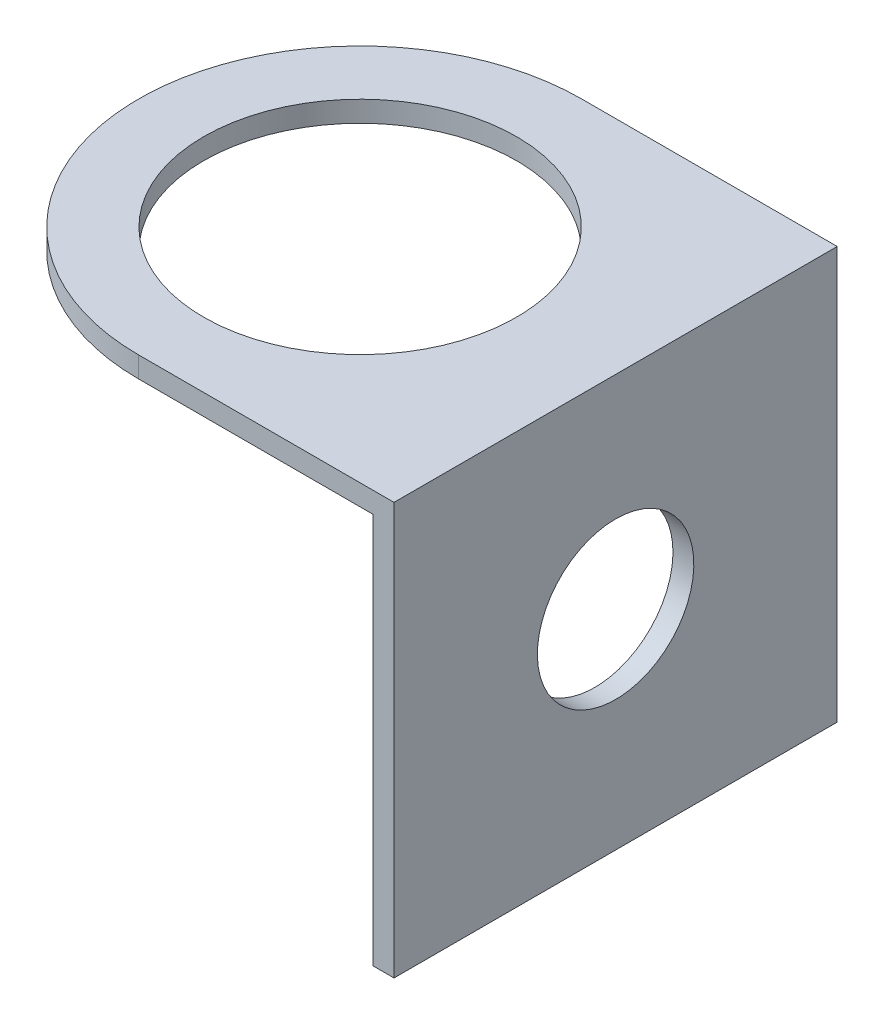
ISO-10303-21;
HEADER;
FILE_DESCRIPTION(('STEP AP214'),'2;1');
FILE_NAME('part.step','',(''),(''),'','','');
FILE_SCHEMA(('AUTOMOTIVE_DESIGN { 1 0 10303 214 1 1 1 1 }'));
ENDSEC;
DATA;
#1=APPLICATION_CONTEXT('core data for automotive mechanical design processes');
#2=APPLICATION_PROTOCOL_DEFINITION('international standard','automotive_design',2000,#1);
#3=PRODUCT_CONTEXT('',#1,'mechanical');
#4=PRODUCT('Part','Part','',(#3));
#5=PRODUCT_RELATED_PRODUCT_CATEGORY('part','',(#4));
#6=PRODUCT_DEFINITION_FORMATION('','',#4);
#7=PRODUCT_DEFINITION_CONTEXT('part definition',#1,'design');
#8=PRODUCT_DEFINITION('design','',#6,#7);
#9=PRODUCT_DEFINITION_SHAPE('','',#8);
#10=(LENGTH_UNIT() NAMED_UNIT(*) SI_UNIT(.MILLI.,.METRE.));
#11=(NAMED_UNIT(*) PLANE_ANGLE_UNIT() SI_UNIT($,.RADIAN.));
#12=(NAMED_UNIT(*) SI_UNIT($,.STERADIAN.) SOLID_ANGLE_UNIT());
#13=UNCERTAINTY_MEASURE_WITH_UNIT(LENGTH_MEASURE(1.E-05),#10,'distance_accuracy_value','');
#14=(GEOMETRIC_REPRESENTATION_CONTEXT(3) GLOBAL_UNCERTAINTY_ASSIGNED_CONTEXT((#13)) GLOBAL_UNIT_ASSIGNED_CONTEXT((#10,
#11,#12)) REPRESENTATION_CONTEXT('',''));
#15=CARTESIAN_POINT('',(0.,0.,0.));
#16=DIRECTION('',(0.,0.,1.));
#17=DIRECTION('',(1.,0.,0.));
#18=AXIS2_PLACEMENT_3D('',#15,#16,#17);
#19=CARTESIAN_POINT('',(0.,0.,170.));
#20=DIRECTION('',(0.,0.,1.));
#21=DIRECTION('',(1.,0.,0.));
#22=AXIS2_PLACEMENT_3D('',#19,#20,#21);
#23=PLANE('',#22);
#24=DIRECTION('',(-1.,0.,0.));
#25=VECTOR('',#24,1.);
#26=CARTESIAN_POINT('',(8.00000000000001,8.00000000000001,170.));
#27=LINE('',#26,#25);
#28=CARTESIAN_POINT('',(8.00000000000001,8.00000000000001,170.));
#29=VERTEX_POINT('',#28);
#30=CARTESIAN_POINT('',(-90.,8.00000000000001,170.));
#31=VERTEX_POINT('',#30);
#32=EDGE_CURVE('E119',#29,#31,#27,.T.);
#33=ORIENTED_EDGE('',*,*,#32,.T.);
#34=DIRECTION('',(0.,1.,0.));
#35=VECTOR('',#34,1.);
#36=CARTESIAN_POINT('',(-90.,-172.,170.));
#37=LINE('',#36,#35);
#38=CARTESIAN_POINT('',(-90.,-1.11022302462516E-13,170.));
#39=VERTEX_POINT('',#38);
#40=EDGE_CURVE('E109',#39,#31,#37,.T.);
#41=ORIENTED_EDGE('',*,*,#40,.F.);
#42=DIRECTION('',(1.,0.,0.));
#43=VECTOR('',#42,1.);
#44=CARTESIAN_POINT('',(-180.,0.,170.));
#45=LINE('',#44,#43);
#46=CARTESIAN_POINT('',(0.,0.,170.));
#47=VERTEX_POINT('',#46);
#48=EDGE_CURVE('E101',#39,#47,#45,.T.);
#49=ORIENTED_EDGE('',*,*,#48,.T.);
#50=DIRECTION('',(0.,-1.,0.));
#51=VECTOR('',#50,1.);
#52=CARTESIAN_POINT('',(0.,0.,170.));
#53=LINE('',#52,#51);
#54=CARTESIAN_POINT('',(0.,-150.,170.));
#55=VERTEX_POINT('',#54);
#56=EDGE_CURVE('E150',#47,#55,#53,.T.);
#57=ORIENTED_EDGE('',*,*,#56,.T.);
#58=DIRECTION('',(1.,0.,0.));
#59=VECTOR('',#58,1.);
#60=CARTESIAN_POINT('',(0.,-150.,170.));
#61=LINE('',#60,#59);
#62=CARTESIAN_POINT('',(8.00000000000002,-150.,170.));
#63=VERTEX_POINT('',#62);
#64=EDGE_CURVE('E128',#55,#63,#61,.T.);
#65=ORIENTED_EDGE('',*,*,#64,.T.);
#66=DIRECTION('',(0.,1.,0.));
#67=VECTOR('',#66,1.);
#68=CARTESIAN_POINT('',(8.00000000000002,-150.,170.));
#69=LINE('',#68,#67);
#70=EDGE_CURVE('E73',#63,#29,#69,.T.);
#71=ORIENTED_EDGE('',*,*,#70,.T.);
#72=EDGE_LOOP('',(#33,#41,#49,#57,#65,#71));
#73=FACE_BOUND('',#72,.T.);
#74=ADVANCED_FACE('F50',(#73),#23,.T.);
#75=CARTESIAN_POINT('',(0.,0.,0.));
#76=DIRECTION('',(0.,0.,1.));
#77=DIRECTION('',(1.,0.,0.));
#78=AXIS2_PLACEMENT_3D('',#75,#76,#77);
#79=PLANE('',#78);
#80=DIRECTION('',(0.,1.,0.));
#81=VECTOR('',#80,1.);
#82=CARTESIAN_POINT('',(-90.,-172.,0.));
#83=LINE('',#82,#81);
#84=CARTESIAN_POINT('',(-90.,8.,0.));
#85=VERTEX_POINT('',#84);
#86=CARTESIAN_POINT('',(-90.,-1.11022302462516E-13,0.));
#87=VERTEX_POINT('',#86);
#88=EDGE_CURVE('E12',#85,#87,#83,.F.);
#89=ORIENTED_EDGE('',*,*,#88,.F.);
#90=DIRECTION('',(-1.,0.,0.));
#91=VECTOR('',#90,1.);
#92=CARTESIAN_POINT('',(8.00000000000001,8.00000000000001,0.));
#93=LINE('',#92,#91);
#94=CARTESIAN_POINT('',(8.00000000000001,8.00000000000001,0.));
#95=VERTEX_POINT('',#94);
#96=EDGE_CURVE('E121',#95,#85,#93,.T.);
#97=ORIENTED_EDGE('',*,*,#96,.F.);
#98=DIRECTION('',(0.,1.,0.));
#99=VECTOR('',#98,1.);
#100=CARTESIAN_POINT('',(8.00000000000002,-150.,0.));
#101=LINE('',#100,#99);
#102=CARTESIAN_POINT('',(8.00000000000002,-150.,0.));
#103=VERTEX_POINT('',#102);
#104=EDGE_CURVE('E94',#103,#95,#101,.T.);
#105=ORIENTED_EDGE('',*,*,#104,.F.);
#106=DIRECTION('',(1.,0.,0.));
#107=VECTOR('',#106,1.);
#108=CARTESIAN_POINT('',(0.,-150.,0.));
#109=LINE('',#108,#107);
#110=CARTESIAN_POINT('',(0.,-150.,0.));
#111=VERTEX_POINT('',#110);
#112=EDGE_CURVE('E137',#111,#103,#109,.T.);
#113=ORIENTED_EDGE('',*,*,#112,.F.);
#114=DIRECTION('',(0.,-1.,0.));
#115=VECTOR('',#114,1.);
#116=CARTESIAN_POINT('',(0.,0.,0.));
#117=LINE('',#116,#115);
#118=CARTESIAN_POINT('',(0.,0.,0.));
#119=VERTEX_POINT('',#118);
#120=EDGE_CURVE('E134',#119,#111,#117,.T.);
#121=ORIENTED_EDGE('',*,*,#120,.F.);
#122=DIRECTION('',(1.,0.,0.));
#123=VECTOR('',#122,1.);
#124=CARTESIAN_POINT('',(-180.,0.,0.));
#125=LINE('',#124,#123);
#126=EDGE_CURVE('E132',#87,#119,#125,.T.);
#127=ORIENTED_EDGE('',*,*,#126,.F.);
#128=EDGE_LOOP('',(#89,#97,#105,#113,#121,#127));
#129=FACE_BOUND('',#128,.T.);
#130=ADVANCED_FACE('F155',(#129),#79,.F.);
#131=CARTESIAN_POINT('',(-180.,0.,170.));
#132=DIRECTION('',(0.,1.,0.));
#133=DIRECTION('',(0.,0.,1.));
#134=AXIS2_PLACEMENT_3D('',#131,#132,#133);
#135=PLANE('',#134);
#136=CARTESIAN_POINT('',(-90.,0.,85.));
#137=DIRECTION('',(0.,1.,0.));
#138=DIRECTION('',(0.,0.,1.));
#139=AXIS2_PLACEMENT_3D('',#136,#137,#138);
#140=CIRCLE('',#139,60.);
#141=CARTESIAN_POINT('',(-150.,0.,85.));
#142=VERTEX_POINT('',#141);
#143=EDGE_CURVE('E135',#142,#142,#140,.T.);
#144=ORIENTED_EDGE('',*,*,#143,.T.);
#145=EDGE_LOOP('',(#144));
#146=FACE_BOUND('',#145,.T.);
#147=ORIENTED_EDGE('',*,*,#48,.F.);
#148=CARTESIAN_POINT('',(-90.,0.,85.));
#149=DIRECTION('',(0.,1.,0.));
#150=DIRECTION('',(0.,0.,1.));
#151=AXIS2_PLACEMENT_3D('',#148,#149,#150);
#152=CIRCLE('',#151,85.);
#153=EDGE_CURVE('E112',#39,#87,#152,.F.);
#154=ORIENTED_EDGE('',*,*,#153,.T.);
#155=ORIENTED_EDGE('',*,*,#126,.T.);
#156=DIRECTION('',(0.,0.,-1.));
#157=VECTOR('',#156,1.);
#158=CARTESIAN_POINT('',(0.,0.,170.));
#159=LINE('',#158,#157);
#160=EDGE_CURVE('E58',#47,#119,#159,.T.);
#161=ORIENTED_EDGE('',*,*,#160,.F.);
#162=EDGE_LOOP('',(#147,#154,#155,#161));
#163=FACE_BOUND('',#162,.T.);
#164=ADVANCED_FACE('F52',(#146,#163),#135,.F.);
#165=CARTESIAN_POINT('',(0.,0.,170.));
#166=DIRECTION('',(1.,0.,0.));
#167=DIRECTION('',(0.,1.,0.));
#168=AXIS2_PLACEMENT_3D('',#165,#166,#167);
#169=PLANE('',#168);
#170=CARTESIAN_POINT('',(0.,-70.,85.));
#171=DIRECTION('',(1.,0.,0.));
#172=DIRECTION('',(0.,1.,0.));
#173=AXIS2_PLACEMENT_3D('',#170,#171,#172);
#174=CIRCLE('',#173,30.);
#175=CARTESIAN_POINT('',(0.,-40.,85.));
#176=VERTEX_POINT('',#175);
#177=EDGE_CURVE('E113',#176,#176,#174,.T.);
#178=ORIENTED_EDGE('',*,*,#177,.T.);
#179=EDGE_LOOP('',(#178));
#180=FACE_BOUND('',#179,.T.);
#181=ORIENTED_EDGE('',*,*,#120,.T.);
#182=DIRECTION('',(0.,0.,-1.));
#183=VECTOR('',#182,1.);
#184=CARTESIAN_POINT('',(0.,-150.,170.));
#185=LINE('',#184,#183);
#186=EDGE_CURVE('E142',#55,#111,#185,.T.);
#187=ORIENTED_EDGE('',*,*,#186,.F.);
#188=ORIENTED_EDGE('',*,*,#56,.F.);
#189=ORIENTED_EDGE('',*,*,#160,.T.);
#190=EDGE_LOOP('',(#181,#187,#188,#189));
#191=FACE_BOUND('',#190,.T.);
#192=ADVANCED_FACE('F148',(#180,#191),#169,.F.);
#193=CARTESIAN_POINT('',(0.,-150.,170.));
#194=DIRECTION('',(0.,1.,0.));
#195=DIRECTION('',(0.,0.,1.));
#196=AXIS2_PLACEMENT_3D('',#193,#194,#195);
#197=PLANE('',#196);
#198=ORIENTED_EDGE('',*,*,#112,.T.);
#199=DIRECTION('',(0.,0.,-1.));
#200=VECTOR('',#199,1.);
#201=CARTESIAN_POINT('',(8.00000000000002,-150.,170.));
#202=LINE('',#201,#200);
#203=EDGE_CURVE('E126',#63,#103,#202,.T.);
#204=ORIENTED_EDGE('',*,*,#203,.F.);
#205=ORIENTED_EDGE('',*,*,#64,.F.);
#206=ORIENTED_EDGE('',*,*,#186,.T.);
#207=EDGE_LOOP('',(#198,#204,#205,#206));
#208=FACE_BOUND('',#207,.T.);
#209=ADVANCED_FACE('F158',(#208),#197,.F.);
#210=CARTESIAN_POINT('',(8.00000000000002,-150.,170.));
#211=DIRECTION('',(-1.,0.,0.));
#212=DIRECTION('',(0.,-1.,0.));
#213=AXIS2_PLACEMENT_3D('',#210,#211,#212);
#214=PLANE('',#213);
#215=CARTESIAN_POINT('',(8.00000000000001,-70.,85.));
#216=DIRECTION('',(1.,0.,0.));
#217=DIRECTION('',(0.,1.,0.));
#218=AXIS2_PLACEMENT_3D('',#215,#216,#217);
#219=CIRCLE('',#218,30.);
#220=CARTESIAN_POINT('',(8.00000000000004,-40.,85.));
#221=VERTEX_POINT('',#220);
#222=EDGE_CURVE('E171',#221,#221,#219,.T.);
#223=ORIENTED_EDGE('',*,*,#222,.F.);
#224=EDGE_LOOP('',(#223));
#225=FACE_BOUND('',#224,.T.);
#226=ORIENTED_EDGE('',*,*,#104,.T.);
#227=DIRECTION('',(0.,0.,-1.));
#228=VECTOR('',#227,1.);
#229=CARTESIAN_POINT('',(8.00000000000001,8.00000000000001,170.));
#230=LINE('',#229,#228);
#231=EDGE_CURVE('E124',#29,#95,#230,.T.);
#232=ORIENTED_EDGE('',*,*,#231,.F.);
#233=ORIENTED_EDGE('',*,*,#70,.F.);
#234=ORIENTED_EDGE('',*,*,#203,.T.);
#235=EDGE_LOOP('',(#226,#232,#233,#234));
#236=FACE_BOUND('',#235,.T.);
#237=ADVANCED_FACE('F160',(#225,#236),#214,.F.);
#238=CARTESIAN_POINT('',(8.00000000000001,8.00000000000001,170.));
#239=DIRECTION('',(0.,-1.,0.));
#240=DIRECTION('',(1.,0.,0.));
#241=AXIS2_PLACEMENT_3D('',#238,#239,#240);
#242=PLANE('',#241);
#243=CARTESIAN_POINT('',(-90.,8.00000000000001,85.));
#244=DIRECTION('',(0.,1.,0.));
#245=DIRECTION('',(-1.,0.,0.));
#246=AXIS2_PLACEMENT_3D('',#243,#244,#245);
#247=CIRCLE('',#246,60.);
#248=CARTESIAN_POINT('',(-150.,7.99999999999998,85.));
#249=VERTEX_POINT('',#248);
#250=EDGE_CURVE('E122',#249,#249,#247,.T.);
#251=ORIENTED_EDGE('',*,*,#250,.F.);
#252=EDGE_LOOP('',(#251));
#253=FACE_BOUND('',#252,.T.);
#254=ORIENTED_EDGE('',*,*,#96,.T.);
#255=CARTESIAN_POINT('',(-90.,8.00000000000001,85.));
#256=DIRECTION('',(0.,-1.,0.));
#257=DIRECTION('',(1.,0.,0.));
#258=AXIS2_PLACEMENT_3D('',#255,#256,#257);
#259=CIRCLE('',#258,85.);
#260=EDGE_CURVE('E64',#31,#85,#259,.T.);
#261=ORIENTED_EDGE('',*,*,#260,.F.);
#262=ORIENTED_EDGE('',*,*,#32,.F.);
#263=ORIENTED_EDGE('',*,*,#231,.T.);
#264=EDGE_LOOP('',(#254,#261,#262,#263));
#265=FACE_BOUND('',#264,.T.);
#266=ADVANCED_FACE('F118',(#253,#265),#242,.F.);
#267=CARTESIAN_POINT('',(-90.,-172.,85.));
#268=DIRECTION('',(0.,1.,0.));
#269=DIRECTION('',(-1.,0.,0.));
#270=AXIS2_PLACEMENT_3D('',#267,#268,#269);
#271=CYLINDRICAL_SURFACE('',#270,85.);
#272=ORIENTED_EDGE('',*,*,#40,.T.);
#273=ORIENTED_EDGE('',*,*,#260,.T.);
#274=ORIENTED_EDGE('',*,*,#88,.T.);
#275=ORIENTED_EDGE('',*,*,#153,.F.);
#276=EDGE_LOOP('',(#272,#273,#274,#275));
#277=FACE_BOUND('',#276,.T.);
#278=ADVANCED_FACE('F110',(#277),#271,.T.);
#279=CARTESIAN_POINT('',(-90.,-172.,85.));
#280=DIRECTION('',(0.,1.,0.));
#281=DIRECTION('',(-1.,0.,0.));
#282=AXIS2_PLACEMENT_3D('',#279,#280,#281);
#283=CYLINDRICAL_SURFACE('',#282,60.);
#284=CARTESIAN_POINT('',(-150.,7.99999999999998,85.));
#285=CARTESIAN_POINT('',(-150.,7.91666666666665,85.));
#286=CARTESIAN_POINT('',(-150.,7.83333333333331,85.));
#287=CARTESIAN_POINT('',(-150.,7.66666666666665,85.));
#288=CARTESIAN_POINT('',(-150.,7.58333333333331,85.));
#289=CARTESIAN_POINT('',(-150.,7.41666666666665,85.));
#290=CARTESIAN_POINT('',(-150.,7.33333333333331,85.));
#291=CARTESIAN_POINT('',(-150.,7.16666666666664,85.));
#292=CARTESIAN_POINT('',(-150.,7.08333333333331,85.));
#293=CARTESIAN_POINT('',(-150.,6.91666666666664,85.));
#294=CARTESIAN_POINT('',(-150.,6.83333333333331,85.));
#295=CARTESIAN_POINT('',(-150.,6.66666666666664,85.));
#296=CARTESIAN_POINT('',(-150.,6.58333333333331,85.));
#297=CARTESIAN_POINT('',(-150.,6.41666666666664,85.));
#298=CARTESIAN_POINT('',(-150.,6.33333333333331,85.));
#299=CARTESIAN_POINT('',(-150.,6.16666666666664,85.));
#300=CARTESIAN_POINT('',(-150.,6.08333333333331,85.));
#301=CARTESIAN_POINT('',(-150.,5.91666666666664,85.));
#302=CARTESIAN_POINT('',(-150.,5.83333333333331,85.));
#303=CARTESIAN_POINT('',(-150.,5.66666666666664,85.));
#304=CARTESIAN_POINT('',(-150.,5.58333333333331,85.));
#305=CARTESIAN_POINT('',(-150.,5.41666666666664,85.));
#306=CARTESIAN_POINT('',(-150.,5.33333333333331,85.));
#307=CARTESIAN_POINT('',(-150.,5.16666666666664,85.));
#308=CARTESIAN_POINT('',(-150.,5.08333333333331,85.));
#309=CARTESIAN_POINT('',(-150.,4.91666666666664,85.));
#310=CARTESIAN_POINT('',(-150.,4.83333333333331,85.));
#311=CARTESIAN_POINT('',(-150.,4.66666666666664,85.));
#312=CARTESIAN_POINT('',(-150.,4.58333333333331,85.));
#313=CARTESIAN_POINT('',(-150.,4.41666666666664,85.));
#314=CARTESIAN_POINT('',(-150.,4.33333333333331,85.));
#315=CARTESIAN_POINT('',(-150.,4.16666666666664,85.));
#316=CARTESIAN_POINT('',(-150.,4.08333333333331,85.));
#317=CARTESIAN_POINT('',(-150.,3.91666666666664,85.));
#318=CARTESIAN_POINT('',(-150.,3.83333333333331,85.));
#319=CARTESIAN_POINT('',(-150.,3.66666666666664,85.));
#320=CARTESIAN_POINT('',(-150.,3.58333333333331,85.));
#321=CARTESIAN_POINT('',(-150.,3.41666666666664,85.));
#322=CARTESIAN_POINT('',(-150.,3.33333333333331,85.));
#323=CARTESIAN_POINT('',(-150.,3.16666666666664,85.));
#324=CARTESIAN_POINT('',(-150.,3.08333333333331,85.));
#325=CARTESIAN_POINT('',(-150.,2.91666666666664,85.));
#326=CARTESIAN_POINT('',(-150.,2.83333333333331,85.));
#327=CARTESIAN_POINT('',(-150.,2.66666666666664,85.));
#328=CARTESIAN_POINT('',(-150.,2.58333333333331,85.));
#329=CARTESIAN_POINT('',(-150.,2.41666666666664,85.));
#330=CARTESIAN_POINT('',(-150.,2.33333333333331,85.));
#331=CARTESIAN_POINT('',(-150.,2.16666666666664,85.));
#332=CARTESIAN_POINT('',(-150.,2.08333333333331,85.));
#333=CARTESIAN_POINT('',(-150.,1.91666666666664,85.));
#334=CARTESIAN_POINT('',(-150.,1.83333333333331,85.));
#335=CARTESIAN_POINT('',(-150.,1.66666666666664,85.));
#336=CARTESIAN_POINT('',(-150.,1.58333333333331,85.));
#337=CARTESIAN_POINT('',(-150.,1.41666666666664,85.));
#338=CARTESIAN_POINT('',(-150.,1.33333333333331,85.));
#339=CARTESIAN_POINT('',(-150.,1.16666666666664,85.));
#340=CARTESIAN_POINT('',(-150.,1.08333333333331,85.));
#341=CARTESIAN_POINT('',(-150.,0.91666666666664,85.));
#342=CARTESIAN_POINT('',(-150.,0.833333333333306,85.));
#343=CARTESIAN_POINT('',(-150.,0.66666666666664,85.));
#344=CARTESIAN_POINT('',(-150.,0.583333333333306,85.));
#345=CARTESIAN_POINT('',(-150.,0.416666666666639,85.));
#346=CARTESIAN_POINT('',(-150.,0.333333333333306,85.));
#347=CARTESIAN_POINT('',(-150.,0.166666666666639,85.));
#348=CARTESIAN_POINT('',(-150.,0.0833333333333056,85.));
#349=CARTESIAN_POINT('',(-150.,0.,85.));
#350=B_SPLINE_CURVE_WITH_KNOTS('',3,(#284,#285,#286,#287,#288,#289,#290,#291,#292,#293,#294,
#295,#296,#297,#298,#299,#300,#301,#302,#303,#304,#305,#306,#307,#308,#309,#310,#311,#312,#313,
#314,#315,#316,#317,#318,#319,#320,#321,#322,#323,#324,#325,#326,#327,#328,#329,#330,#331,#332,
#333,#334,#335,#336,#337,#338,#339,#340,#341,#342,#343,#344,#345,#346,#347,#348,#349),
.UNSPECIFIED.,.F.,.F.,(4,2,2,2,2,2,2,2,2,2,2,2,2,2,2,2,2,2,2,2,2,2,2,2,2,2,2,2,2,2,2,2,4),(0.,
0.25,0.5,0.750000000000001,1.,1.25,1.5,1.75,2.,2.25,2.5,2.75,3.,3.25,3.5,3.75,4.,4.25,4.5,4.75,
5.,5.25,5.50000000000001,5.75000000000001,6.00000000000001,6.25000000000001,6.50000000000001,
6.75000000000001,7.00000000000001,7.25000000000001,7.50000000000001,7.75000000000001,
8.00000000000001),.UNSPECIFIED.);
#351=EDGE_CURVE('BSEAM194',#249,#142,#350,.T.);
#352=ORIENTED_EDGE('',*,*,#250,.T.);
#353=ORIENTED_EDGE('',*,*,#143,.F.);
#354=ORIENTED_EDGE('',*,*,#351,.T.);
#355=ORIENTED_EDGE('',*,*,#351,.F.);
#356=EDGE_LOOP('',(#352,#354,#353,#355));
#357=FACE_BOUND('',#356,.T.);
#358=ADVANCED_FACE('F194',(#357),#283,.F.);
#359=CARTESIAN_POINT('',(-172.,-70.,85.));
#360=DIRECTION('',(1.,0.,0.));
#361=DIRECTION('',(0.,1.,0.));
#362=AXIS2_PLACEMENT_3D('',#359,#360,#361);
#363=CYLINDRICAL_SURFACE('',#362,30.);
#364=CARTESIAN_POINT('',(8.00000000000004,-40.,85.));
#365=CARTESIAN_POINT('',(7.9166666666667,-40.,85.));
#366=CARTESIAN_POINT('',(7.83333333333337,-40.,85.));
#367=CARTESIAN_POINT('',(7.6666666666667,-40.,85.));
#368=CARTESIAN_POINT('',(7.58333333333337,-40.,85.));
#369=CARTESIAN_POINT('',(7.4166666666667,-40.,85.));
#370=CARTESIAN_POINT('',(7.33333333333337,-40.,85.));
#371=CARTESIAN_POINT('',(7.1666666666667,-40.,85.));
#372=CARTESIAN_POINT('',(7.08333333333337,-40.,85.));
#373=CARTESIAN_POINT('',(6.9166666666667,-40.,85.));
#374=CARTESIAN_POINT('',(6.83333333333337,-40.,85.));
#375=CARTESIAN_POINT('',(6.6666666666667,-40.,85.));
#376=CARTESIAN_POINT('',(6.58333333333337,-40.,85.));
#377=CARTESIAN_POINT('',(6.4166666666667,-40.,85.));
#378=CARTESIAN_POINT('',(6.33333333333337,-40.,85.));
#379=CARTESIAN_POINT('',(6.1666666666667,-40.,85.));
#380=CARTESIAN_POINT('',(6.08333333333337,-40.,85.));
#381=CARTESIAN_POINT('',(5.91666666666669,-40.,85.));
#382=CARTESIAN_POINT('',(5.83333333333335,-40.,85.));
#383=CARTESIAN_POINT('',(5.66666666666667,-40.,85.));
#384=CARTESIAN_POINT('',(5.58333333333334,-40.,85.));
#385=CARTESIAN_POINT('',(5.41666666666667,-40.,85.));
#386=CARTESIAN_POINT('',(5.33333333333334,-40.,85.));
#387=CARTESIAN_POINT('',(5.16666666666667,-40.,85.));
#388=CARTESIAN_POINT('',(5.08333333333334,-40.,85.));
#389=CARTESIAN_POINT('',(4.91666666666667,-40.,85.));
#390=CARTESIAN_POINT('',(4.83333333333334,-40.,85.));
#391=CARTESIAN_POINT('',(4.66666666666667,-40.,85.));
#392=CARTESIAN_POINT('',(4.58333333333334,-40.,85.));
#393=CARTESIAN_POINT('',(4.41666666666667,-40.,85.));
#394=CARTESIAN_POINT('',(4.33333333333334,-40.,85.));
#395=CARTESIAN_POINT('',(4.16666666666667,-40.,85.));
#396=CARTESIAN_POINT('',(4.08333333333334,-40.,85.));
#397=CARTESIAN_POINT('',(3.91666666666667,-40.,85.));
#398=CARTESIAN_POINT('',(3.83333333333334,-40.,85.));
#399=CARTESIAN_POINT('',(3.66666666666667,-40.,85.));
#400=CARTESIAN_POINT('',(3.58333333333334,-40.,85.));
#401=CARTESIAN_POINT('',(3.41666666666667,-40.,85.));
#402=CARTESIAN_POINT('',(3.33333333333334,-40.,85.));
#403=CARTESIAN_POINT('',(3.16666666666667,-40.,85.));
#404=CARTESIAN_POINT('',(3.08333333333334,-40.,85.));
#405=CARTESIAN_POINT('',(2.91666666666667,-40.,85.));
#406=CARTESIAN_POINT('',(2.83333333333334,-40.,85.));
#407=CARTESIAN_POINT('',(2.66666666666667,-40.,85.));
#408=CARTESIAN_POINT('',(2.58333333333334,-40.,85.));
#409=CARTESIAN_POINT('',(2.41666666666667,-40.,85.));
#410=CARTESIAN_POINT('',(2.33333333333334,-40.,85.));
#411=CARTESIAN_POINT('',(2.16666666666666,-40.,85.));
#412=CARTESIAN_POINT('',(2.08333333333332,-40.,85.));
#413=CARTESIAN_POINT('',(1.91666666666664,-40.,85.));
#414=CARTESIAN_POINT('',(1.83333333333331,-40.,85.));
#415=CARTESIAN_POINT('',(1.66666666666664,-40.,85.));
#416=CARTESIAN_POINT('',(1.58333333333331,-40.,85.));
#417=CARTESIAN_POINT('',(1.41666666666664,-40.,85.));
#418=CARTESIAN_POINT('',(1.33333333333331,-40.,85.));
#419=CARTESIAN_POINT('',(1.16666666666664,-40.,85.));
#420=CARTESIAN_POINT('',(1.08333333333331,-40.,85.));
#421=CARTESIAN_POINT('',(0.91666666666664,-40.,85.));
#422=CARTESIAN_POINT('',(0.833333333333306,-40.,85.));
#423=CARTESIAN_POINT('',(0.66666666666664,-40.,85.));
#424=CARTESIAN_POINT('',(0.583333333333306,-40.,85.));
#425=CARTESIAN_POINT('',(0.416666666666639,-40.,85.));
#426=CARTESIAN_POINT('',(0.333333333333306,-40.,85.));
#427=CARTESIAN_POINT('',(0.166666666666639,-40.,85.));
#428=CARTESIAN_POINT('',(0.0833333333333056,-40.,85.));
#429=CARTESIAN_POINT('',(0.,-40.,85.));
#430=B_SPLINE_CURVE_WITH_KNOTS('',3,(#364,#365,#366,#367,#368,#369,#370,#371,#372,#373,#374,
#375,#376,#377,#378,#379,#380,#381,#382,#383,#384,#385,#386,#387,#388,#389,#390,#391,#392,#393,
#394,#395,#396,#397,#398,#399,#400,#401,#402,#403,#404,#405,#406,#407,#408,#409,#410,#411,#412,
#413,#414,#415,#416,#417,#418,#419,#420,#421,#422,#423,#424,#425,#426,#427,#428,#429),
.UNSPECIFIED.,.F.,.F.,(4,2,2,2,2,2,2,2,2,2,2,2,2,2,2,2,2,2,2,2,2,2,2,2,2,2,2,2,2,2,2,2,4),(0.,
0.25,0.5,0.750000000000001,1.,1.25,1.5,1.75,2.,2.25000000000003,2.50000000000003,
2.75000000000003,3.00000000000003,3.25000000000003,3.50000000000003,3.75000000000003,
4.00000000000003,4.25000000000003,4.50000000000003,4.75000000000003,5.00000000000003,
5.25000000000003,5.50000000000003,5.75000000000003,6.00000000000006,6.25000000000006,
6.50000000000006,6.75000000000006,7.00000000000006,7.25000000000006,7.50000000000006,
7.75000000000006,8.00000000000006),.UNSPECIFIED.);
#431=EDGE_CURVE('BSEAM175',#221,#176,#430,.T.);
#432=ORIENTED_EDGE('',*,*,#222,.T.);
#433=ORIENTED_EDGE('',*,*,#177,.F.);
#434=ORIENTED_EDGE('',*,*,#431,.T.);
#435=ORIENTED_EDGE('',*,*,#431,.F.);
#436=EDGE_LOOP('',(#432,#434,#433,#435));
#437=FACE_BOUND('',#436,.T.);
#438=ADVANCED_FACE('F175',(#437),#363,.F.);
#439=CLOSED_SHELL('',(#74,#130,#164,#192,#209,#237,#266,#278,#358,#438));
#440=MANIFOLD_SOLID_BREP('B2',#439);
#441=ADVANCED_BREP_SHAPE_REPRESENTATION('',(#18,#440),#14);
#442=SHAPE_DEFINITION_REPRESENTATION(#9,#441);
ENDSEC;
END-ISO-10303-21;
